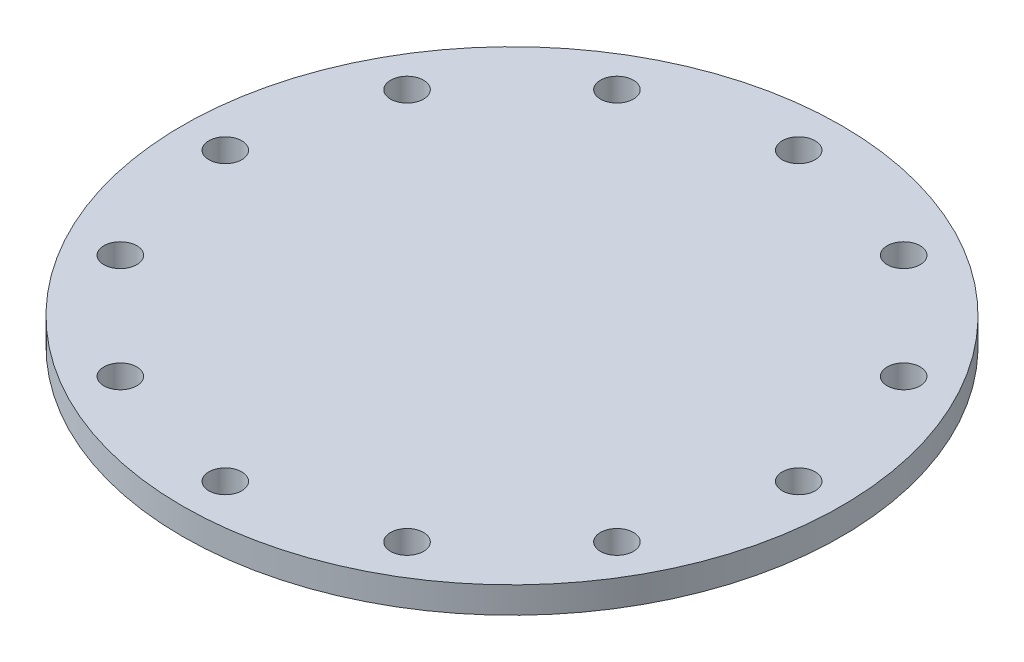
ISO-10303-21;
HEADER;
FILE_DESCRIPTION(('STEP AP214'),'2;1');
FILE_NAME('part.step','',(''),(''),'','','');
FILE_SCHEMA(('AUTOMOTIVE_DESIGN { 1 0 10303 214 1 1 1 1 }'));
ENDSEC;
DATA;
#1=APPLICATION_CONTEXT('core data for automotive mechanical design processes');
#2=APPLICATION_PROTOCOL_DEFINITION('international standard','automotive_design',2000,#1);
#3=PRODUCT_CONTEXT('',#1,'mechanical');
#4=PRODUCT('Part','Part','',(#3));
#5=PRODUCT_RELATED_PRODUCT_CATEGORY('part','',(#4));
#6=PRODUCT_DEFINITION_FORMATION('','',#4);
#7=PRODUCT_DEFINITION_CONTEXT('part definition',#1,'design');
#8=PRODUCT_DEFINITION('design','',#6,#7);
#9=PRODUCT_DEFINITION_SHAPE('','',#8);
#10=(LENGTH_UNIT() NAMED_UNIT(*) SI_UNIT(.MILLI.,.METRE.));
#11=(NAMED_UNIT(*) PLANE_ANGLE_UNIT() SI_UNIT($,.RADIAN.));
#12=(NAMED_UNIT(*) SI_UNIT($,.STERADIAN.) SOLID_ANGLE_UNIT());
#13=UNCERTAINTY_MEASURE_WITH_UNIT(LENGTH_MEASURE(1.E-05),#10,'distance_accuracy_value','');
#14=(GEOMETRIC_REPRESENTATION_CONTEXT(3) GLOBAL_UNCERTAINTY_ASSIGNED_CONTEXT((#13)) GLOBAL_UNIT_ASSIGNED_CONTEXT((#10,
#11,#12)) REPRESENTATION_CONTEXT('',''));
#15=CARTESIAN_POINT('',(0.,0.,0.));
#16=DIRECTION('',(0.,0.,1.));
#17=DIRECTION('',(1.,0.,0.));
#18=AXIS2_PLACEMENT_3D('',#15,#16,#17);
#19=CARTESIAN_POINT('',(0.,20.,0.));
#20=DIRECTION('',(0.,-1.,0.));
#21=DIRECTION('',(0.,0.,-1.));
#22=AXIS2_PLACEMENT_3D('',#19,#20,#21);
#23=CYLINDRICAL_SURFACE('',#22,250.);
#24=CARTESIAN_POINT('',(0.,20.,0.));
#25=DIRECTION('',(0.,1.,0.));
#26=DIRECTION('',(0.,0.,1.));
#27=AXIS2_PLACEMENT_3D('',#24,#25,#26);
#28=CIRCLE('',#27,250.);
#29=CARTESIAN_POINT('',(0.,20.,250.));
#30=VERTEX_POINT('',#29);
#31=EDGE_CURVE('E10',#30,#30,#28,.T.);
#32=ORIENTED_EDGE('',*,*,#31,.F.);
#33=EDGE_LOOP('',(#32));
#34=FACE_BOUND('',#33,.T.);
#35=CARTESIAN_POINT('',(0.,0.,0.));
#36=DIRECTION('',(0.,1.,0.));
#37=DIRECTION('',(0.,0.,1.));
#38=AXIS2_PLACEMENT_3D('',#35,#36,#37);
#39=CIRCLE('',#38,250.);
#40=CARTESIAN_POINT('',(0.,0.,250.));
#41=VERTEX_POINT('',#40);
#42=EDGE_CURVE('E39',#41,#41,#39,.T.);
#43=ORIENTED_EDGE('',*,*,#42,.T.);
#44=EDGE_LOOP('',(#43));
#45=FACE_BOUND('',#44,.T.);
#46=ADVANCED_FACE('F36',(#34,#45),#23,.T.);
#47=CARTESIAN_POINT('',(0.,20.,0.));
#48=DIRECTION('',(0.,1.,0.));
#49=DIRECTION('',(0.,0.,1.));
#50=AXIS2_PLACEMENT_3D('',#47,#48,#49);
#51=PLANE('',#50);
#52=CARTESIAN_POINT('',(0.,20.,-217.5));
#53=DIRECTION('',(0.,1.,0.));
#54=DIRECTION('',(0.,0.,1.));
#55=AXIS2_PLACEMENT_3D('',#52,#53,#54);
#56=CIRCLE('',#55,12.5);
#57=CARTESIAN_POINT('',(0.,20.,-205.));
#58=VERTEX_POINT('',#57);
#59=EDGE_CURVE('E83',#58,#58,#56,.T.);
#60=ORIENTED_EDGE('',*,*,#59,.F.);
#61=EDGE_LOOP('',(#60));
#62=FACE_BOUND('',#61,.T.);
#63=CARTESIAN_POINT('',(-108.749999999999,20.,-188.360525323111));
#64=DIRECTION('',(0.,1.,0.));
#65=DIRECTION('',(0.,0.,1.));
#66=AXIS2_PLACEMENT_3D('',#63,#64,#65);
#67=CIRCLE('',#66,12.5000000000053);
#68=CARTESIAN_POINT('',(-108.749999999999,20.,-175.860525323105));
#69=VERTEX_POINT('',#68);
#70=EDGE_CURVE('E116',#69,#69,#67,.T.);
#71=ORIENTED_EDGE('',*,*,#70,.F.);
#72=EDGE_LOOP('',(#71));
#73=FACE_BOUND('',#72,.T.);
#74=CARTESIAN_POINT('',(-188.360525323111,20.,-108.749999999992));
#75=DIRECTION('',(0.,1.,0.));
#76=DIRECTION('',(0.,0.,1.));
#77=AXIS2_PLACEMENT_3D('',#74,#75,#76);
#78=CIRCLE('',#77,12.5000000000093);
#79=CARTESIAN_POINT('',(-188.360525323111,20.,-96.2499999999826));
#80=VERTEX_POINT('',#79);
#81=EDGE_CURVE('E124',#80,#80,#78,.T.);
#82=ORIENTED_EDGE('',*,*,#81,.F.);
#83=EDGE_LOOP('',(#82));
#84=FACE_BOUND('',#83,.T.);
#85=CARTESIAN_POINT('',(-217.499999999991,20.,9.25926466772858E-12));
#86=DIRECTION('',(0.,1.,0.));
#87=DIRECTION('',(0.,0.,1.));
#88=AXIS2_PLACEMENT_3D('',#85,#86,#87);
#89=CIRCLE('',#88,12.5000000000137);
#90=CARTESIAN_POINT('',(-217.499999999991,20.,12.500000000023));
#91=VERTEX_POINT('',#90);
#92=EDGE_CURVE('E132',#91,#91,#89,.T.);
#93=ORIENTED_EDGE('',*,*,#92,.F.);
#94=EDGE_LOOP('',(#93));
#95=FACE_BOUND('',#94,.T.);
#96=CARTESIAN_POINT('',(108.75,20.,-188.360525323115));
#97=DIRECTION('',(0.,1.,0.));
#98=DIRECTION('',(0.,0.,1.));
#99=AXIS2_PLACEMENT_3D('',#96,#97,#98);
#100=CIRCLE('',#99,12.5);
#101=CARTESIAN_POINT('',(108.75,20.,-175.860525323115));
#102=VERTEX_POINT('',#101);
#103=EDGE_CURVE('E75',#102,#102,#100,.T.);
#104=ORIENTED_EDGE('',*,*,#103,.F.);
#105=EDGE_LOOP('',(#104));
#106=FACE_BOUND('',#105,.T.);
#107=CARTESIAN_POINT('',(188.36052532312,20.,-108.750000000008));
#108=DIRECTION('',(0.,1.,0.));
#109=DIRECTION('',(0.,0.,1.));
#110=AXIS2_PLACEMENT_3D('',#107,#108,#109);
#111=CIRCLE('',#110,12.5000000000026);
#112=CARTESIAN_POINT('',(188.36052532312,20.,-96.2500000000054));
#113=VERTEX_POINT('',#112);
#114=EDGE_CURVE('E67',#113,#113,#111,.T.);
#115=ORIENTED_EDGE('',*,*,#114,.F.);
#116=EDGE_LOOP('',(#115));
#117=FACE_BOUND('',#116,.T.);
#118=CARTESIAN_POINT('',(217.500000000009,20.,-9.23262859984713E-12));
#119=DIRECTION('',(0.,1.,0.));
#120=DIRECTION('',(0.,0.,1.));
#121=AXIS2_PLACEMENT_3D('',#118,#119,#120);
#122=CIRCLE('',#121,12.5000000000069);
#123=CARTESIAN_POINT('',(217.500000000009,20.,12.4999999999976));
#124=VERTEX_POINT('',#123);
#125=EDGE_CURVE('E59',#124,#124,#122,.T.);
#126=ORIENTED_EDGE('',*,*,#125,.F.);
#127=EDGE_LOOP('',(#126));
#128=FACE_BOUND('',#127,.T.);
#129=CARTESIAN_POINT('',(188.360525323129,20.,108.749999999992));
#130=DIRECTION('',(0.,1.,0.));
#131=DIRECTION('',(0.,0.,1.));
#132=AXIS2_PLACEMENT_3D('',#129,#130,#131);
#133=CIRCLE('',#132,12.5000000000119);
#134=CARTESIAN_POINT('',(188.360525323129,20.,121.250000000004));
#135=VERTEX_POINT('',#134);
#136=EDGE_CURVE('E50',#135,#135,#133,.T.);
#137=ORIENTED_EDGE('',*,*,#136,.F.);
#138=EDGE_LOOP('',(#137));
#139=FACE_BOUND('',#138,.T.);
#140=CARTESIAN_POINT('',(108.750000000017,20.,188.360525323111));
#141=DIRECTION('',(0.,1.,0.));
#142=DIRECTION('',(0.,0.,1.));
#143=AXIS2_PLACEMENT_3D('',#140,#141,#142);
#144=CIRCLE('',#143,12.5000000000164);
#145=CARTESIAN_POINT('',(108.750000000017,20.,200.860525323127));
#146=VERTEX_POINT('',#145);
#147=EDGE_CURVE('E109',#146,#146,#144,.T.);
#148=ORIENTED_EDGE('',*,*,#147,.F.);
#149=EDGE_LOOP('',(#148));
#150=FACE_BOUND('',#149,.T.);
#151=CARTESIAN_POINT('',(1.84652571996943E-11,20.,217.5));
#152=DIRECTION('',(0.,1.,0.));
#153=DIRECTION('',(0.,0.,1.));
#154=AXIS2_PLACEMENT_3D('',#151,#152,#153);
#155=CIRCLE('',#154,12.5000000000191);
#156=CARTESIAN_POINT('',(1.84652571996943E-11,20.,230.000000000019));
#157=VERTEX_POINT('',#156);
#158=EDGE_CURVE('E101',#157,#157,#155,.T.);
#159=ORIENTED_EDGE('',*,*,#158,.F.);
#160=EDGE_LOOP('',(#159));
#161=FACE_BOUND('',#160,.T.);
#162=CARTESIAN_POINT('',(-108.749999999983,20.,188.36052532312));
#163=DIRECTION('',(0.,1.,0.));
#164=DIRECTION('',(0.,0.,1.));
#165=AXIS2_PLACEMENT_3D('',#162,#163,#164);
#166=CIRCLE('',#165,12.5000000000196);
#167=CARTESIAN_POINT('',(-108.749999999983,20.,200.86052532314));
#168=VERTEX_POINT('',#167);
#169=EDGE_CURVE('E93',#168,#168,#166,.T.);
#170=ORIENTED_EDGE('',*,*,#169,.F.);
#171=EDGE_LOOP('',(#170));
#172=FACE_BOUND('',#171,.T.);
#173=CARTESIAN_POINT('',(-188.360525323102,20.,108.750000000008));
#174=DIRECTION('',(0.,1.,0.));
#175=DIRECTION('',(0.,0.,1.));
#176=AXIS2_PLACEMENT_3D('',#173,#174,#175);
#177=CIRCLE('',#176,12.5000000000175);
#178=CARTESIAN_POINT('',(-188.360525323102,20.,121.250000000026));
#179=VERTEX_POINT('',#178);
#180=EDGE_CURVE('E84',#179,#179,#177,.T.);
#181=ORIENTED_EDGE('',*,*,#180,.F.);
#182=EDGE_LOOP('',(#181));
#183=FACE_BOUND('',#182,.T.);
#184=ORIENTED_EDGE('',*,*,#31,.T.);
#185=EDGE_LOOP('',(#184));
#186=FACE_BOUND('',#185,.T.);
#187=ADVANCED_FACE('F156',(#62,#73,#84,#95,#106,#117,#128,#139,#150,#161,#172,#183,#186),#51,.T.);
#188=CARTESIAN_POINT('',(0.,0.,0.));
#189=DIRECTION('',(0.,1.,0.));
#190=DIRECTION('',(0.,0.,1.));
#191=AXIS2_PLACEMENT_3D('',#188,#189,#190);
#192=PLANE('',#191);
#193=CARTESIAN_POINT('',(0.,0.,-217.5));
#194=DIRECTION('',(0.,1.,0.));
#195=DIRECTION('',(0.,0.,1.));
#196=AXIS2_PLACEMENT_3D('',#193,#194,#195);
#197=CIRCLE('',#196,12.5);
#198=CARTESIAN_POINT('',(0.,0.,-205.));
#199=VERTEX_POINT('',#198);
#200=EDGE_CURVE('E48',#199,#199,#197,.T.);
#201=ORIENTED_EDGE('',*,*,#200,.T.);
#202=EDGE_LOOP('',(#201));
#203=FACE_BOUND('',#202,.T.);
#204=CARTESIAN_POINT('',(-108.749999999999,0.,-188.360525323111));
#205=DIRECTION('',(0.,1.,0.));
#206=DIRECTION('',(0.,0.,1.));
#207=AXIS2_PLACEMENT_3D('',#204,#205,#206);
#208=CIRCLE('',#207,12.5000000000053);
#209=CARTESIAN_POINT('',(-108.749999999999,0.,-175.860525323105));
#210=VERTEX_POINT('',#209);
#211=EDGE_CURVE('E120',#210,#210,#208,.T.);
#212=ORIENTED_EDGE('',*,*,#211,.T.);
#213=EDGE_LOOP('',(#212));
#214=FACE_BOUND('',#213,.T.);
#215=CARTESIAN_POINT('',(-188.360525323111,0.,-108.749999999992));
#216=DIRECTION('',(0.,1.,0.));
#217=DIRECTION('',(0.,0.,1.));
#218=AXIS2_PLACEMENT_3D('',#215,#216,#217);
#219=CIRCLE('',#218,12.5000000000093);
#220=CARTESIAN_POINT('',(-188.360525323111,0.,-96.2499999999826));
#221=VERTEX_POINT('',#220);
#222=EDGE_CURVE('E128',#221,#221,#219,.T.);
#223=ORIENTED_EDGE('',*,*,#222,.T.);
#224=EDGE_LOOP('',(#223));
#225=FACE_BOUND('',#224,.T.);
#226=CARTESIAN_POINT('',(-217.499999999991,0.,9.25926466772858E-12));
#227=DIRECTION('',(0.,1.,0.));
#228=DIRECTION('',(0.,0.,1.));
#229=AXIS2_PLACEMENT_3D('',#226,#227,#228);
#230=CIRCLE('',#229,12.5000000000137);
#231=CARTESIAN_POINT('',(-217.499999999991,0.,12.500000000023));
#232=VERTEX_POINT('',#231);
#233=EDGE_CURVE('E89',#232,#232,#230,.T.);
#234=ORIENTED_EDGE('',*,*,#233,.T.);
#235=EDGE_LOOP('',(#234));
#236=FACE_BOUND('',#235,.T.);
#237=CARTESIAN_POINT('',(108.75,0.,-188.360525323115));
#238=DIRECTION('',(0.,1.,0.));
#239=DIRECTION('',(0.,0.,1.));
#240=AXIS2_PLACEMENT_3D('',#237,#238,#239);
#241=CIRCLE('',#240,12.5);
#242=CARTESIAN_POINT('',(108.75,0.,-175.860525323115));
#243=VERTEX_POINT('',#242);
#244=EDGE_CURVE('E79',#243,#243,#241,.T.);
#245=ORIENTED_EDGE('',*,*,#244,.T.);
#246=EDGE_LOOP('',(#245));
#247=FACE_BOUND('',#246,.T.);
#248=CARTESIAN_POINT('',(188.36052532312,0.,-108.750000000008));
#249=DIRECTION('',(0.,1.,0.));
#250=DIRECTION('',(0.,0.,1.));
#251=AXIS2_PLACEMENT_3D('',#248,#249,#250);
#252=CIRCLE('',#251,12.5000000000026);
#253=CARTESIAN_POINT('',(188.36052532312,0.,-96.2500000000054));
#254=VERTEX_POINT('',#253);
#255=EDGE_CURVE('E71',#254,#254,#252,.T.);
#256=ORIENTED_EDGE('',*,*,#255,.T.);
#257=EDGE_LOOP('',(#256));
#258=FACE_BOUND('',#257,.T.);
#259=CARTESIAN_POINT('',(217.500000000009,0.,-9.23262859984713E-12));
#260=DIRECTION('',(0.,1.,0.));
#261=DIRECTION('',(0.,0.,1.));
#262=AXIS2_PLACEMENT_3D('',#259,#260,#261);
#263=CIRCLE('',#262,12.5000000000069);
#264=CARTESIAN_POINT('',(217.500000000009,0.,12.4999999999976));
#265=VERTEX_POINT('',#264);
#266=EDGE_CURVE('E63',#265,#265,#263,.T.);
#267=ORIENTED_EDGE('',*,*,#266,.T.);
#268=EDGE_LOOP('',(#267));
#269=FACE_BOUND('',#268,.T.);
#270=CARTESIAN_POINT('',(188.360525323129,0.,108.749999999992));
#271=DIRECTION('',(0.,1.,0.));
#272=DIRECTION('',(0.,0.,1.));
#273=AXIS2_PLACEMENT_3D('',#270,#271,#272);
#274=CIRCLE('',#273,12.5000000000119);
#275=CARTESIAN_POINT('',(188.360525323129,0.,121.250000000004));
#276=VERTEX_POINT('',#275);
#277=EDGE_CURVE('E54',#276,#276,#274,.T.);
#278=ORIENTED_EDGE('',*,*,#277,.T.);
#279=EDGE_LOOP('',(#278));
#280=FACE_BOUND('',#279,.T.);
#281=CARTESIAN_POINT('',(108.750000000017,0.,188.360525323111));
#282=DIRECTION('',(0.,1.,0.));
#283=DIRECTION('',(0.,0.,1.));
#284=AXIS2_PLACEMENT_3D('',#281,#282,#283);
#285=CIRCLE('',#284,12.5000000000164);
#286=CARTESIAN_POINT('',(108.750000000017,0.,200.860525323127));
#287=VERTEX_POINT('',#286);
#288=EDGE_CURVE('E55',#287,#287,#285,.T.);
#289=ORIENTED_EDGE('',*,*,#288,.T.);
#290=EDGE_LOOP('',(#289));
#291=FACE_BOUND('',#290,.T.);
#292=CARTESIAN_POINT('',(1.84652571996943E-11,0.,217.5));
#293=DIRECTION('',(0.,1.,0.));
#294=DIRECTION('',(0.,0.,1.));
#295=AXIS2_PLACEMENT_3D('',#292,#293,#294);
#296=CIRCLE('',#295,12.5000000000191);
#297=CARTESIAN_POINT('',(1.84652571996943E-11,0.,230.000000000019));
#298=VERTEX_POINT('',#297);
#299=EDGE_CURVE('E105',#298,#298,#296,.T.);
#300=ORIENTED_EDGE('',*,*,#299,.T.);
#301=EDGE_LOOP('',(#300));
#302=FACE_BOUND('',#301,.T.);
#303=CARTESIAN_POINT('',(-108.749999999983,0.,188.36052532312));
#304=DIRECTION('',(0.,1.,0.));
#305=DIRECTION('',(0.,0.,1.));
#306=AXIS2_PLACEMENT_3D('',#303,#304,#305);
#307=CIRCLE('',#306,12.5000000000196);
#308=CARTESIAN_POINT('',(-108.749999999983,0.,200.86052532314));
#309=VERTEX_POINT('',#308);
#310=EDGE_CURVE('E97',#309,#309,#307,.T.);
#311=ORIENTED_EDGE('',*,*,#310,.T.);
#312=EDGE_LOOP('',(#311));
#313=FACE_BOUND('',#312,.T.);
#314=CARTESIAN_POINT('',(-188.360525323102,0.,108.750000000008));
#315=DIRECTION('',(0.,1.,0.));
#316=DIRECTION('',(0.,0.,1.));
#317=AXIS2_PLACEMENT_3D('',#314,#315,#316);
#318=CIRCLE('',#317,12.5000000000175);
#319=CARTESIAN_POINT('',(-188.360525323102,0.,121.250000000026));
#320=VERTEX_POINT('',#319);
#321=EDGE_CURVE('E88',#320,#320,#318,.T.);
#322=ORIENTED_EDGE('',*,*,#321,.T.);
#323=EDGE_LOOP('',(#322));
#324=FACE_BOUND('',#323,.T.);
#325=ORIENTED_EDGE('',*,*,#42,.F.);
#326=EDGE_LOOP('',(#325));
#327=FACE_BOUND('',#326,.T.);
#328=ADVANCED_FACE('F146',(#203,#214,#225,#236,#247,#258,#269,#280,#291,#302,#313,#324,#327),
#192,.F.);
#329=CARTESIAN_POINT('',(-188.360525323102,0.,108.750000000008));
#330=DIRECTION('',(0.,1.,0.));
#331=DIRECTION('',(0.,0.,1.));
#332=AXIS2_PLACEMENT_3D('',#329,#330,#331);
#333=CYLINDRICAL_SURFACE('',#332,12.5000000000175);
#334=ORIENTED_EDGE('',*,*,#321,.F.);
#335=EDGE_LOOP('',(#334));
#336=FACE_BOUND('',#335,.T.);
#337=ORIENTED_EDGE('',*,*,#180,.T.);
#338=EDGE_LOOP('',(#337));
#339=FACE_BOUND('',#338,.T.);
#340=ADVANCED_FACE('F182',(#336,#339),#333,.F.);
#341=CARTESIAN_POINT('',(-108.749999999983,0.,188.36052532312));
#342=DIRECTION('',(0.,1.,0.));
#343=DIRECTION('',(0.,0.,1.));
#344=AXIS2_PLACEMENT_3D('',#341,#342,#343);
#345=CYLINDRICAL_SURFACE('',#344,12.5000000000196);
#346=ORIENTED_EDGE('',*,*,#310,.F.);
#347=EDGE_LOOP('',(#346));
#348=FACE_BOUND('',#347,.T.);
#349=ORIENTED_EDGE('',*,*,#169,.T.);
#350=EDGE_LOOP('',(#349));
#351=FACE_BOUND('',#350,.T.);
#352=ADVANCED_FACE('F184',(#348,#351),#345,.F.);
#353=CARTESIAN_POINT('',(1.84652571996943E-11,0.,217.5));
#354=DIRECTION('',(0.,1.,0.));
#355=DIRECTION('',(0.,0.,1.));
#356=AXIS2_PLACEMENT_3D('',#353,#354,#355);
#357=CYLINDRICAL_SURFACE('',#356,12.5000000000191);
#358=ORIENTED_EDGE('',*,*,#299,.F.);
#359=EDGE_LOOP('',(#358));
#360=FACE_BOUND('',#359,.T.);
#361=ORIENTED_EDGE('',*,*,#158,.T.);
#362=EDGE_LOOP('',(#361));
#363=FACE_BOUND('',#362,.T.);
#364=ADVANCED_FACE('F191',(#360,#363),#357,.F.);
#365=CARTESIAN_POINT('',(108.750000000017,0.,188.360525323111));
#366=DIRECTION('',(0.,1.,0.));
#367=DIRECTION('',(0.,0.,1.));
#368=AXIS2_PLACEMENT_3D('',#365,#366,#367);
#369=CYLINDRICAL_SURFACE('',#368,12.5000000000164);
#370=ORIENTED_EDGE('',*,*,#288,.F.);
#371=EDGE_LOOP('',(#370));
#372=FACE_BOUND('',#371,.T.);
#373=ORIENTED_EDGE('',*,*,#147,.T.);
#374=EDGE_LOOP('',(#373));
#375=FACE_BOUND('',#374,.T.);
#376=ADVANCED_FACE('F230',(#372,#375),#369,.F.);
#377=CARTESIAN_POINT('',(188.360525323129,0.,108.749999999992));
#378=DIRECTION('',(0.,1.,0.));
#379=DIRECTION('',(0.,0.,1.));
#380=AXIS2_PLACEMENT_3D('',#377,#378,#379);
#381=CYLINDRICAL_SURFACE('',#380,12.5000000000119);
#382=ORIENTED_EDGE('',*,*,#277,.F.);
#383=EDGE_LOOP('',(#382));
#384=FACE_BOUND('',#383,.T.);
#385=ORIENTED_EDGE('',*,*,#136,.T.);
#386=EDGE_LOOP('',(#385));
#387=FACE_BOUND('',#386,.T.);
#388=ADVANCED_FACE('F240',(#384,#387),#381,.F.);
#389=CARTESIAN_POINT('',(217.500000000009,0.,-9.23262859984713E-12));
#390=DIRECTION('',(0.,1.,0.));
#391=DIRECTION('',(0.,0.,1.));
#392=AXIS2_PLACEMENT_3D('',#389,#390,#391);
#393=CYLINDRICAL_SURFACE('',#392,12.5000000000069);
#394=ORIENTED_EDGE('',*,*,#266,.F.);
#395=EDGE_LOOP('',(#394));
#396=FACE_BOUND('',#395,.T.);
#397=ORIENTED_EDGE('',*,*,#125,.T.);
#398=EDGE_LOOP('',(#397));
#399=FACE_BOUND('',#398,.T.);
#400=ADVANCED_FACE('F250',(#396,#399),#393,.F.);
#401=CARTESIAN_POINT('',(188.36052532312,0.,-108.750000000008));
#402=DIRECTION('',(0.,1.,0.));
#403=DIRECTION('',(0.,0.,1.));
#404=AXIS2_PLACEMENT_3D('',#401,#402,#403);
#405=CYLINDRICAL_SURFACE('',#404,12.5000000000026);
#406=ORIENTED_EDGE('',*,*,#255,.F.);
#407=EDGE_LOOP('',(#406));
#408=FACE_BOUND('',#407,.T.);
#409=ORIENTED_EDGE('',*,*,#114,.T.);
#410=EDGE_LOOP('',(#409));
#411=FACE_BOUND('',#410,.T.);
#412=ADVANCED_FACE('F260',(#408,#411),#405,.F.);
#413=CARTESIAN_POINT('',(108.75,0.,-188.360525323115));
#414=DIRECTION('',(0.,1.,0.));
#415=DIRECTION('',(0.,0.,1.));
#416=AXIS2_PLACEMENT_3D('',#413,#414,#415);
#417=CYLINDRICAL_SURFACE('',#416,12.5);
#418=ORIENTED_EDGE('',*,*,#244,.F.);
#419=EDGE_LOOP('',(#418));
#420=FACE_BOUND('',#419,.T.);
#421=ORIENTED_EDGE('',*,*,#103,.T.);
#422=EDGE_LOOP('',(#421));
#423=FACE_BOUND('',#422,.T.);
#424=ADVANCED_FACE('F270',(#420,#423),#417,.F.);
#425=CARTESIAN_POINT('',(-217.499999999991,0.,9.25926466772858E-12));
#426=DIRECTION('',(0.,1.,0.));
#427=DIRECTION('',(0.,0.,1.));
#428=AXIS2_PLACEMENT_3D('',#425,#426,#427);
#429=CYLINDRICAL_SURFACE('',#428,12.5000000000137);
#430=ORIENTED_EDGE('',*,*,#233,.F.);
#431=EDGE_LOOP('',(#430));
#432=FACE_BOUND('',#431,.T.);
#433=ORIENTED_EDGE('',*,*,#92,.T.);
#434=EDGE_LOOP('',(#433));
#435=FACE_BOUND('',#434,.T.);
#436=ADVANCED_FACE('F280',(#432,#435),#429,.F.);
#437=CARTESIAN_POINT('',(-188.360525323111,0.,-108.749999999992));
#438=DIRECTION('',(0.,1.,0.));
#439=DIRECTION('',(0.,0.,1.));
#440=AXIS2_PLACEMENT_3D('',#437,#438,#439);
#441=CYLINDRICAL_SURFACE('',#440,12.5000000000093);
#442=ORIENTED_EDGE('',*,*,#222,.F.);
#443=EDGE_LOOP('',(#442));
#444=FACE_BOUND('',#443,.T.);
#445=ORIENTED_EDGE('',*,*,#81,.T.);
#446=EDGE_LOOP('',(#445));
#447=FACE_BOUND('',#446,.T.);
#448=ADVANCED_FACE('F289',(#444,#447),#441,.F.);
#449=CARTESIAN_POINT('',(-108.749999999999,0.,-188.360525323111));
#450=DIRECTION('',(0.,1.,0.));
#451=DIRECTION('',(0.,0.,1.));
#452=AXIS2_PLACEMENT_3D('',#449,#450,#451);
#453=CYLINDRICAL_SURFACE('',#452,12.5000000000053);
#454=ORIENTED_EDGE('',*,*,#211,.F.);
#455=EDGE_LOOP('',(#454));
#456=FACE_BOUND('',#455,.T.);
#457=ORIENTED_EDGE('',*,*,#70,.T.);
#458=EDGE_LOOP('',(#457));
#459=FACE_BOUND('',#458,.T.);
#460=ADVANCED_FACE('F152',(#456,#459),#453,.F.);
#461=CARTESIAN_POINT('',(0.,0.,-217.5));
#462=DIRECTION('',(0.,1.,0.));
#463=DIRECTION('',(0.,0.,1.));
#464=AXIS2_PLACEMENT_3D('',#461,#462,#463);
#465=CYLINDRICAL_SURFACE('',#464,12.5);
#466=ORIENTED_EDGE('',*,*,#200,.F.);
#467=EDGE_LOOP('',(#466));
#468=FACE_BOUND('',#467,.T.);
#469=ORIENTED_EDGE('',*,*,#59,.T.);
#470=EDGE_LOOP('',(#469));
#471=FACE_BOUND('',#470,.T.);
#472=ADVANCED_FACE('F149',(#468,#471),#465,.F.);
#473=CLOSED_SHELL('',(#46,#187,#328,#340,#352,#364,#376,#388,#400,#412,#424,#436,#448,#460,#472));
#474=MANIFOLD_SOLID_BREP('B2',#473);
#475=ADVANCED_BREP_SHAPE_REPRESENTATION('',(#18,#474),#14);
#476=SHAPE_DEFINITION_REPRESENTATION(#9,#475);
ENDSEC;
END-ISO-10303-21;
